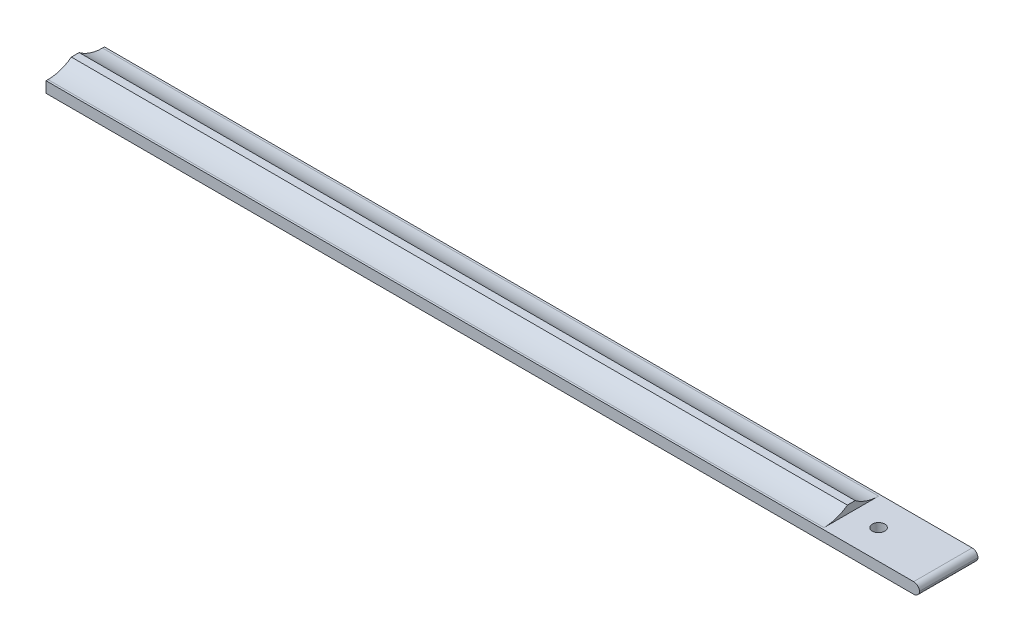
ISO-10303-21;
HEADER;
FILE_DESCRIPTION(('STEP AP214'),'2;1');
FILE_NAME('part.step','',(''),(''),'','','');
FILE_SCHEMA(('AUTOMOTIVE_DESIGN { 1 0 10303 214 1 1 1 1 }'));
ENDSEC;
DATA;
#1=APPLICATION_CONTEXT('core data for automotive mechanical design processes');
#2=APPLICATION_PROTOCOL_DEFINITION('international standard','automotive_design',2000,#1);
#3=PRODUCT_CONTEXT('',#1,'mechanical');
#4=PRODUCT('Part','Part','',(#3));
#5=PRODUCT_RELATED_PRODUCT_CATEGORY('part','',(#4));
#6=PRODUCT_DEFINITION_FORMATION('','',#4);
#7=PRODUCT_DEFINITION_CONTEXT('part definition',#1,'design');
#8=PRODUCT_DEFINITION('design','',#6,#7);
#9=PRODUCT_DEFINITION_SHAPE('','',#8);
#10=(LENGTH_UNIT() NAMED_UNIT(*) SI_UNIT(.MILLI.,.METRE.));
#11=(NAMED_UNIT(*) PLANE_ANGLE_UNIT() SI_UNIT($,.RADIAN.));
#12=(NAMED_UNIT(*) SI_UNIT($,.STERADIAN.) SOLID_ANGLE_UNIT());
#13=UNCERTAINTY_MEASURE_WITH_UNIT(LENGTH_MEASURE(1.E-05),#10,'distance_accuracy_value','');
#14=(GEOMETRIC_REPRESENTATION_CONTEXT(3) GLOBAL_UNCERTAINTY_ASSIGNED_CONTEXT((#13)) GLOBAL_UNIT_ASSIGNED_CONTEXT((#10,
#11,#12)) REPRESENTATION_CONTEXT('',''));
#15=CARTESIAN_POINT('',(0.,0.,0.));
#16=DIRECTION('',(0.,0.,1.));
#17=DIRECTION('',(1.,0.,0.));
#18=AXIS2_PLACEMENT_3D('',#15,#16,#17);
#19=CARTESIAN_POINT('',(-112.,2.8,-7.5));
#20=DIRECTION('',(0.,0.,1.));
#21=DIRECTION('',(1.,0.,0.));
#22=AXIS2_PLACEMENT_3D('',#19,#20,#21);
#23=PLANE('',#22);
#24=CARTESIAN_POINT('',(110.5,1.3,-7.5));
#25=DIRECTION('',(0.,0.,1.));
#26=DIRECTION('',(1.,0.,0.));
#27=AXIS2_PLACEMENT_3D('',#24,#25,#26);
#28=CIRCLE('',#27,1.5);
#29=CARTESIAN_POINT('',(110.5,2.8,-7.5));
#30=VERTEX_POINT('',#29);
#31=CARTESIAN_POINT('',(111.99666295471,1.4,-7.5));
#32=VERTEX_POINT('',#31);
#33=EDGE_CURVE('E118',#30,#32,#28,.F.);
#34=ORIENTED_EDGE('',*,*,#33,.T.);
#35=CARTESIAN_POINT('',(110.5,1.5,-7.5));
#36=DIRECTION('',(0.,0.,1.));
#37=DIRECTION('',(1.,0.,0.));
#38=AXIS2_PLACEMENT_3D('',#35,#36,#37);
#39=CIRCLE('',#38,1.5);
#40=CARTESIAN_POINT('',(110.5,0.,-7.5));
#41=VERTEX_POINT('',#40);
#42=EDGE_CURVE('E172',#32,#41,#39,.F.);
#43=ORIENTED_EDGE('',*,*,#42,.T.);
#44=DIRECTION('',(-1.,0.,0.));
#45=VECTOR('',#44,1.);
#46=CARTESIAN_POINT('',(-112.,0.,-7.5));
#47=LINE('',#46,#45);
#48=CARTESIAN_POINT('',(-112.,0.,-7.5));
#49=VERTEX_POINT('',#48);
#50=EDGE_CURVE('E140',#41,#49,#47,.T.);
#51=ORIENTED_EDGE('',*,*,#50,.T.);
#52=DIRECTION('',(0.,-1.,0.));
#53=VECTOR('',#52,1.);
#54=CARTESIAN_POINT('',(-112.,2.8,-7.5));
#55=LINE('',#54,#53);
#56=CARTESIAN_POINT('',(-112.,2.8,-7.5));
#57=VERTEX_POINT('',#56);
#58=EDGE_CURVE('E158',#57,#49,#55,.T.);
#59=ORIENTED_EDGE('',*,*,#58,.F.);
#60=DIRECTION('',(-1.,0.,0.));
#61=VECTOR('',#60,1.);
#62=CARTESIAN_POINT('',(-112.,2.8,-7.5));
#63=LINE('',#62,#61);
#64=EDGE_CURVE('E143',#30,#57,#63,.T.);
#65=ORIENTED_EDGE('',*,*,#64,.F.);
#66=EDGE_LOOP('',(#34,#43,#51,#59,#65));
#67=FACE_BOUND('',#66,.T.);
#68=ADVANCED_FACE('F39',(#67),#23,.F.);
#69=CARTESIAN_POINT('',(-112.,2.8,-7.5));
#70=DIRECTION('',(1.,0.,0.));
#71=DIRECTION('',(0.,0.,-1.));
#72=AXIS2_PLACEMENT_3D('',#69,#70,#71);
#73=PLANE('',#72);
#74=DIRECTION('',(0.,0.,1.));
#75=VECTOR('',#74,1.);
#76=CARTESIAN_POINT('',(-112.,0.,-7.5));
#77=LINE('',#76,#75);
#78=CARTESIAN_POINT('',(-112.,0.,7.5));
#79=VERTEX_POINT('',#78);
#80=EDGE_CURVE('E153',#49,#79,#77,.T.);
#81=ORIENTED_EDGE('',*,*,#80,.T.);
#82=DIRECTION('',(0.,-1.,0.));
#83=VECTOR('',#82,1.);
#84=CARTESIAN_POINT('',(-112.,2.8,7.5));
#85=LINE('',#84,#83);
#86=CARTESIAN_POINT('',(-112.,2.8,7.5));
#87=VERTEX_POINT('',#86);
#88=EDGE_CURVE('E151',#87,#79,#85,.T.);
#89=ORIENTED_EDGE('',*,*,#88,.F.);
#90=DIRECTION('',(0.,0.,1.));
#91=VECTOR('',#90,1.);
#92=CARTESIAN_POINT('',(-112.,2.8,-7.5));
#93=LINE('',#92,#91);
#94=CARTESIAN_POINT('',(-112.,2.8,7.));
#95=VERTEX_POINT('',#94);
#96=EDGE_CURVE('E114',#95,#87,#93,.T.);
#97=ORIENTED_EDGE('',*,*,#96,.F.);
#98=CARTESIAN_POINT('',(-112.,12.8,7.));
#99=DIRECTION('',(1.,0.,0.));
#100=DIRECTION('',(0.,0.,-1.));
#101=AXIS2_PLACEMENT_3D('',#98,#99,#100);
#102=CIRCLE('',#101,10.);
#103=CARTESIAN_POINT('',(-112.,4.8,0.999999999999999));
#104=VERTEX_POINT('',#103);
#105=EDGE_CURVE('E109',#95,#104,#102,.T.);
#106=ORIENTED_EDGE('',*,*,#105,.T.);
#107=DIRECTION('',(0.,0.,1.));
#108=VECTOR('',#107,1.);
#109=CARTESIAN_POINT('',(-112.,4.8,-1.));
#110=LINE('',#109,#108);
#111=CARTESIAN_POINT('',(-112.,4.8,-1.));
#112=VERTEX_POINT('',#111);
#113=EDGE_CURVE('E112',#112,#104,#110,.T.);
#114=ORIENTED_EDGE('',*,*,#113,.F.);
#115=CARTESIAN_POINT('',(-112.,12.8,-7.));
#116=DIRECTION('',(1.,0.,0.));
#117=DIRECTION('',(0.,0.,-1.));
#118=AXIS2_PLACEMENT_3D('',#115,#116,#117);
#119=CIRCLE('',#118,10.);
#120=CARTESIAN_POINT('',(-112.,2.8,-7.));
#121=VERTEX_POINT('',#120);
#122=EDGE_CURVE('E166',#112,#121,#119,.T.);
#123=ORIENTED_EDGE('',*,*,#122,.T.);
#124=EDGE_CURVE('E146',#57,#121,#93,.T.);
#125=ORIENTED_EDGE('',*,*,#124,.F.);
#126=ORIENTED_EDGE('',*,*,#58,.T.);
#127=EDGE_LOOP('',(#81,#89,#97,#106,#114,#123,#125,#126));
#128=FACE_BOUND('',#127,.T.);
#129=ADVANCED_FACE('F111',(#128),#73,.F.);
#130=CARTESIAN_POINT('',(-112.,2.8,7.5));
#131=DIRECTION('',(0.,0.,-1.));
#132=DIRECTION('',(-1.,0.,0.));
#133=AXIS2_PLACEMENT_3D('',#130,#131,#132);
#134=PLANE('',#133);
#135=DIRECTION('',(1.,0.,0.));
#136=VECTOR('',#135,1.);
#137=CARTESIAN_POINT('',(-112.,0.,7.5));
#138=LINE('',#137,#136);
#139=CARTESIAN_POINT('',(110.5,0.,7.5));
#140=VERTEX_POINT('',#139);
#141=EDGE_CURVE('E145',#79,#140,#138,.T.);
#142=ORIENTED_EDGE('',*,*,#141,.T.);
#143=CARTESIAN_POINT('',(110.5,1.5,7.5));
#144=DIRECTION('',(0.,0.,-1.));
#145=DIRECTION('',(-1.,0.,0.));
#146=AXIS2_PLACEMENT_3D('',#143,#144,#145);
#147=CIRCLE('',#146,1.5);
#148=CARTESIAN_POINT('',(111.99666295471,1.4,7.5));
#149=VERTEX_POINT('',#148);
#150=EDGE_CURVE('E48',#140,#149,#147,.F.);
#151=ORIENTED_EDGE('',*,*,#150,.T.);
#152=CARTESIAN_POINT('',(110.5,1.3,7.5));
#153=DIRECTION('',(0.,0.,-1.));
#154=DIRECTION('',(-1.,0.,0.));
#155=AXIS2_PLACEMENT_3D('',#152,#153,#154);
#156=CIRCLE('',#155,1.5);
#157=CARTESIAN_POINT('',(110.5,2.8,7.5));
#158=VERTEX_POINT('',#157);
#159=EDGE_CURVE('E58',#149,#158,#156,.F.);
#160=ORIENTED_EDGE('',*,*,#159,.T.);
#161=DIRECTION('',(1.,0.,0.));
#162=VECTOR('',#161,1.);
#163=CARTESIAN_POINT('',(-112.,2.8,7.5));
#164=LINE('',#163,#162);
#165=EDGE_CURVE('E149',#87,#158,#164,.T.);
#166=ORIENTED_EDGE('',*,*,#165,.F.);
#167=ORIENTED_EDGE('',*,*,#88,.T.);
#168=EDGE_LOOP('',(#142,#151,#160,#166,#167));
#169=FACE_BOUND('',#168,.T.);
#170=ADVANCED_FACE('F186',(#169),#134,.F.);
#171=CARTESIAN_POINT('',(0.,2.8,0.));
#172=DIRECTION('',(0.,1.,0.));
#173=DIRECTION('',(0.,0.,1.));
#174=AXIS2_PLACEMENT_3D('',#171,#172,#173);
#175=PLANE('',#174);
#176=CARTESIAN_POINT('',(94.,2.8,0.));
#177=DIRECTION('',(0.,1.,0.));
#178=DIRECTION('',(0.,0.,1.));
#179=AXIS2_PLACEMENT_3D('',#176,#177,#178);
#180=CIRCLE('',#179,1.60000000000001);
#181=CARTESIAN_POINT('',(94.,2.8,1.60000000000003));
#182=VERTEX_POINT('',#181);
#183=EDGE_CURVE('E196',#182,#182,#180,.T.);
#184=ORIENTED_EDGE('',*,*,#183,.F.);
#185=EDGE_LOOP('',(#184));
#186=FACE_BOUND('',#185,.T.);
#187=ORIENTED_EDGE('',*,*,#165,.T.);
#188=DIRECTION('',(0.,0.,-1.));
#189=VECTOR('',#188,1.);
#190=CARTESIAN_POINT('',(110.5,2.8,-7.5));
#191=LINE('',#190,#189);
#192=EDGE_CURVE('E11',#158,#30,#191,.T.);
#193=ORIENTED_EDGE('',*,*,#192,.T.);
#194=ORIENTED_EDGE('',*,*,#64,.T.);
#195=ORIENTED_EDGE('',*,*,#124,.T.);
#196=DIRECTION('',(1.,0.,0.));
#197=VECTOR('',#196,1.);
#198=CARTESIAN_POINT('',(87.,2.8,-7.));
#199=LINE('',#198,#197);
#200=CARTESIAN_POINT('',(87.,2.8,-7.));
#201=VERTEX_POINT('',#200);
#202=EDGE_CURVE('E163',#121,#201,#199,.T.);
#203=ORIENTED_EDGE('',*,*,#202,.T.);
#204=DIRECTION('',(0.,0.,-1.));
#205=VECTOR('',#204,1.);
#206=CARTESIAN_POINT('',(87.,2.8,-1.));
#207=LINE('',#206,#205);
#208=CARTESIAN_POINT('',(87.,2.8,7.));
#209=VERTEX_POINT('',#208);
#210=EDGE_CURVE('E130',#209,#201,#207,.T.);
#211=ORIENTED_EDGE('',*,*,#210,.F.);
#212=DIRECTION('',(-1.,0.,0.));
#213=VECTOR('',#212,1.);
#214=CARTESIAN_POINT('',(-112.,2.8,7.));
#215=LINE('',#214,#213);
#216=EDGE_CURVE('E161',#209,#95,#215,.T.);
#217=ORIENTED_EDGE('',*,*,#216,.T.);
#218=ORIENTED_EDGE('',*,*,#96,.T.);
#219=EDGE_LOOP('',(#187,#193,#194,#195,#203,#211,#217,#218));
#220=FACE_BOUND('',#219,.T.);
#221=ADVANCED_FACE('F236',(#186,#220),#175,.T.);
#222=CARTESIAN_POINT('',(0.,0.,0.));
#223=DIRECTION('',(0.,1.,0.));
#224=DIRECTION('',(0.,0.,1.));
#225=AXIS2_PLACEMENT_3D('',#222,#223,#224);
#226=PLANE('',#225);
#227=CARTESIAN_POINT('',(94.,0.,0.));
#228=DIRECTION('',(0.,1.,0.));
#229=DIRECTION('',(0.,0.,1.));
#230=AXIS2_PLACEMENT_3D('',#227,#228,#229);
#231=CIRCLE('',#230,1.60000000000001);
#232=CARTESIAN_POINT('',(94.,0.,1.60000000000003));
#233=VERTEX_POINT('',#232);
#234=EDGE_CURVE('E142',#233,#233,#231,.T.);
#235=ORIENTED_EDGE('',*,*,#234,.T.);
#236=EDGE_LOOP('',(#235));
#237=FACE_BOUND('',#236,.T.);
#238=ORIENTED_EDGE('',*,*,#50,.F.);
#239=DIRECTION('',(0.,0.,-1.));
#240=VECTOR('',#239,1.);
#241=CARTESIAN_POINT('',(110.5,0.,1.022330368509E-13));
#242=LINE('',#241,#240);
#243=EDGE_CURVE('E174',#41,#140,#242,.F.);
#244=ORIENTED_EDGE('',*,*,#243,.T.);
#245=ORIENTED_EDGE('',*,*,#141,.F.);
#246=ORIENTED_EDGE('',*,*,#80,.F.);
#247=EDGE_LOOP('',(#238,#244,#245,#246));
#248=FACE_BOUND('',#247,.T.);
#249=ADVANCED_FACE('F182',(#237,#248),#226,.F.);
#250=CARTESIAN_POINT('',(87.,4.8,-1.));
#251=DIRECTION('',(-1.,0.,0.));
#252=DIRECTION('',(0.,0.,1.));
#253=AXIS2_PLACEMENT_3D('',#250,#251,#252);
#254=PLANE('',#253);
#255=ORIENTED_EDGE('',*,*,#210,.T.);
#256=CARTESIAN_POINT('',(87.,12.8,-7.));
#257=DIRECTION('',(-1.,0.,0.));
#258=DIRECTION('',(0.,0.,1.));
#259=AXIS2_PLACEMENT_3D('',#256,#257,#258);
#260=CIRCLE('',#259,10.);
#261=CARTESIAN_POINT('',(87.,4.8,-1.));
#262=VERTEX_POINT('',#261);
#263=EDGE_CURVE('E168',#201,#262,#260,.T.);
#264=ORIENTED_EDGE('',*,*,#263,.T.);
#265=DIRECTION('',(0.,0.,-1.));
#266=VECTOR('',#265,1.);
#267=CARTESIAN_POINT('',(87.,4.8,-1.));
#268=LINE('',#267,#266);
#269=CARTESIAN_POINT('',(87.,4.8,0.999999999999999));
#270=VERTEX_POINT('',#269);
#271=EDGE_CURVE('E134',#270,#262,#268,.T.);
#272=ORIENTED_EDGE('',*,*,#271,.F.);
#273=CARTESIAN_POINT('',(87.,12.8,7.));
#274=DIRECTION('',(-1.,0.,0.));
#275=DIRECTION('',(0.,0.,1.));
#276=AXIS2_PLACEMENT_3D('',#273,#274,#275);
#277=CIRCLE('',#276,10.);
#278=EDGE_CURVE('E119',#270,#209,#277,.T.);
#279=ORIENTED_EDGE('',*,*,#278,.T.);
#280=EDGE_LOOP('',(#255,#264,#272,#279));
#281=FACE_BOUND('',#280,.T.);
#282=ADVANCED_FACE('F216',(#281),#254,.F.);
#283=CARTESIAN_POINT('',(0.,4.8,0.));
#284=DIRECTION('',(0.,1.,0.));
#285=DIRECTION('',(0.,0.,1.));
#286=AXIS2_PLACEMENT_3D('',#283,#284,#285);
#287=PLANE('',#286);
#288=ORIENTED_EDGE('',*,*,#113,.T.);
#289=DIRECTION('',(1.,0.,0.));
#290=VECTOR('',#289,1.);
#291=CARTESIAN_POINT('',(-112.,4.8,0.999999999999999));
#292=LINE('',#291,#290);
#293=EDGE_CURVE('E126',#104,#270,#292,.T.);
#294=ORIENTED_EDGE('',*,*,#293,.T.);
#295=ORIENTED_EDGE('',*,*,#271,.T.);
#296=DIRECTION('',(-1.,0.,0.));
#297=VECTOR('',#296,1.);
#298=CARTESIAN_POINT('',(-112.,4.8,-1.));
#299=LINE('',#298,#297);
#300=EDGE_CURVE('E129',#262,#112,#299,.T.);
#301=ORIENTED_EDGE('',*,*,#300,.T.);
#302=EDGE_LOOP('',(#288,#294,#295,#301));
#303=FACE_BOUND('',#302,.T.);
#304=ADVANCED_FACE('F124',(#303),#287,.T.);
#305=CARTESIAN_POINT('',(94.,0.,0.));
#306=DIRECTION('',(0.,1.,0.));
#307=DIRECTION('',(0.,0.,1.));
#308=AXIS2_PLACEMENT_3D('',#305,#306,#307);
#309=CYLINDRICAL_SURFACE('',#308,1.60000000000001);
#310=ORIENTED_EDGE('',*,*,#234,.F.);
#311=EDGE_LOOP('',(#310));
#312=FACE_BOUND('',#311,.T.);
#313=ORIENTED_EDGE('',*,*,#183,.T.);
#314=EDGE_LOOP('',(#313));
#315=FACE_BOUND('',#314,.T.);
#316=ADVANCED_FACE('F205',(#312,#315),#309,.F.);
#317=CARTESIAN_POINT('',(-112.,12.8,-7.));
#318=DIRECTION('',(-1.,0.,0.));
#319=DIRECTION('',(0.,0.,1.));
#320=AXIS2_PLACEMENT_3D('',#317,#318,#319);
#321=CYLINDRICAL_SURFACE('',#320,10.);
#322=ORIENTED_EDGE('',*,*,#263,.F.);
#323=ORIENTED_EDGE('',*,*,#202,.F.);
#324=ORIENTED_EDGE('',*,*,#122,.F.);
#325=ORIENTED_EDGE('',*,*,#300,.F.);
#326=EDGE_LOOP('',(#322,#323,#324,#325));
#327=FACE_BOUND('',#326,.T.);
#328=ADVANCED_FACE('F207',(#327),#321,.F.);
#329=CARTESIAN_POINT('',(-112.,12.8,7.));
#330=DIRECTION('',(1.,0.,0.));
#331=DIRECTION('',(0.,0.,-1.));
#332=AXIS2_PLACEMENT_3D('',#329,#330,#331);
#333=CYLINDRICAL_SURFACE('',#332,10.);
#334=ORIENTED_EDGE('',*,*,#105,.F.);
#335=ORIENTED_EDGE('',*,*,#216,.F.);
#336=ORIENTED_EDGE('',*,*,#278,.F.);
#337=ORIENTED_EDGE('',*,*,#293,.F.);
#338=EDGE_LOOP('',(#334,#335,#336,#337));
#339=FACE_BOUND('',#338,.T.);
#340=ADVANCED_FACE('F132',(#339),#333,.F.);
#341=CARTESIAN_POINT('',(110.5,1.3,1.022330368509E-13));
#342=DIRECTION('',(0.,0.,1.));
#343=DIRECTION('',(1.,0.,0.));
#344=AXIS2_PLACEMENT_3D('',#341,#342,#343);
#345=CYLINDRICAL_SURFACE('',#344,1.5);
#346=ORIENTED_EDGE('',*,*,#192,.F.);
#347=ORIENTED_EDGE('',*,*,#159,.F.);
#348=DIRECTION('',(0.,0.,1.));
#349=VECTOR('',#348,1.);
#350=CARTESIAN_POINT('',(111.99666295471,1.4,0.));
#351=LINE('',#350,#349);
#352=EDGE_CURVE('E43',#32,#149,#351,.T.);
#353=ORIENTED_EDGE('',*,*,#352,.F.);
#354=ORIENTED_EDGE('',*,*,#33,.F.);
#355=EDGE_LOOP('',(#346,#347,#353,#354));
#356=FACE_BOUND('',#355,.T.);
#357=ADVANCED_FACE('F41',(#356),#345,.T.);
#358=CARTESIAN_POINT('',(110.5,1.5,-7.5));
#359=DIRECTION('',(0.,0.,-1.));
#360=DIRECTION('',(-1.,0.,0.));
#361=AXIS2_PLACEMENT_3D('',#358,#359,#360);
#362=CYLINDRICAL_SURFACE('',#361,1.5);
#363=ORIENTED_EDGE('',*,*,#150,.F.);
#364=ORIENTED_EDGE('',*,*,#243,.F.);
#365=ORIENTED_EDGE('',*,*,#42,.F.);
#366=ORIENTED_EDGE('',*,*,#352,.T.);
#367=EDGE_LOOP('',(#363,#364,#365,#366));
#368=FACE_BOUND('',#367,.T.);
#369=ADVANCED_FACE('F194',(#368),#362,.T.);
#370=CLOSED_SHELL('',(#68,#129,#170,#221,#249,#282,#304,#316,#328,#340,#357,#369));
#371=MANIFOLD_SOLID_BREP('B2',#370);
#372=ADVANCED_BREP_SHAPE_REPRESENTATION('',(#18,#371),#14);
#373=SHAPE_DEFINITION_REPRESENTATION(#9,#372);
ENDSEC;
END-ISO-10303-21;
